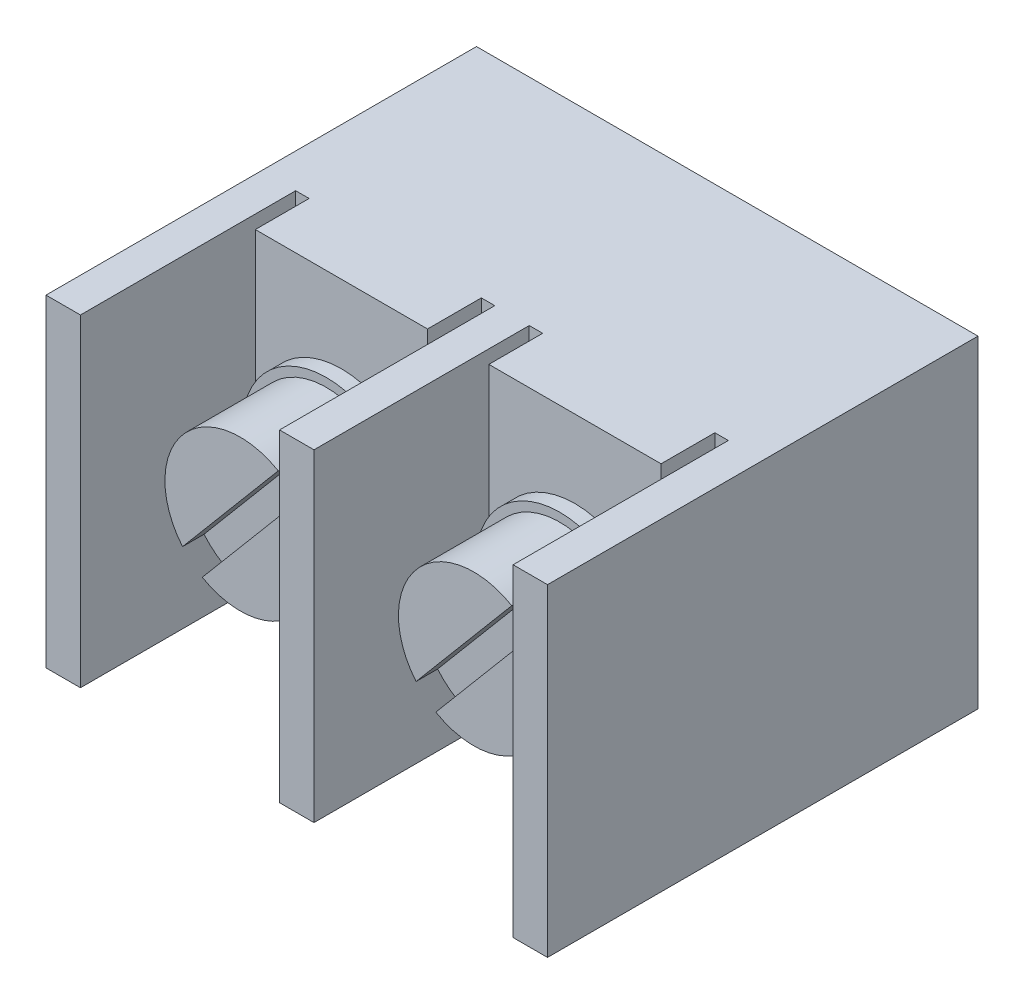
ISO-10303-21;
HEADER;
FILE_DESCRIPTION(('STEP AP214'),'2;1');
FILE_NAME('part.step','',(''),(''),'','','');
FILE_SCHEMA(('AUTOMOTIVE_DESIGN { 1 0 10303 214 1 1 1 1 }'));
ENDSEC;
DATA;
#1=APPLICATION_CONTEXT('core data for automotive mechanical design processes');
#2=APPLICATION_PROTOCOL_DEFINITION('international standard','automotive_design',2000,#1);
#3=PRODUCT_CONTEXT('',#1,'mechanical');
#4=PRODUCT('Part','Part','',(#3));
#5=PRODUCT_RELATED_PRODUCT_CATEGORY('part','',(#4));
#6=PRODUCT_DEFINITION_FORMATION('','',#4);
#7=PRODUCT_DEFINITION_CONTEXT('part definition',#1,'design');
#8=PRODUCT_DEFINITION('design','',#6,#7);
#9=PRODUCT_DEFINITION_SHAPE('','',#8);
#10=(LENGTH_UNIT() NAMED_UNIT(*) SI_UNIT(.MILLI.,.METRE.));
#11=(NAMED_UNIT(*) PLANE_ANGLE_UNIT() SI_UNIT($,.RADIAN.));
#12=(NAMED_UNIT(*) SI_UNIT($,.STERADIAN.) SOLID_ANGLE_UNIT());
#13=UNCERTAINTY_MEASURE_WITH_UNIT(LENGTH_MEASURE(1.E-05),#10,'distance_accuracy_value','');
#14=(GEOMETRIC_REPRESENTATION_CONTEXT(3) GLOBAL_UNCERTAINTY_ASSIGNED_CONTEXT((#13)) GLOBAL_UNIT_ASSIGNED_CONTEXT((#10,
#11,#12)) REPRESENTATION_CONTEXT('',''));
#15=CARTESIAN_POINT('',(0.,0.,0.));
#16=DIRECTION('',(0.,0.,1.));
#17=DIRECTION('',(1.,0.,0.));
#18=AXIS2_PLACEMENT_3D('',#15,#16,#17);
#19=CARTESIAN_POINT('',(-22.5,7.5,0.));
#20=DIRECTION('',(0.,0.,-1.));
#21=DIRECTION('',(-1.,0.,0.));
#22=AXIS2_PLACEMENT_3D('',#19,#20,#21);
#23=PLANE('',#22);
#24=DIRECTION('',(0.,1.,0.));
#25=VECTOR('',#24,1.);
#26=CARTESIAN_POINT('',(0.799999999999999,7.50000000000001,0.));
#27=LINE('',#26,#25);
#28=CARTESIAN_POINT('',(0.800000000000002,-7.5,0.));
#29=VERTEX_POINT('',#28);
#30=CARTESIAN_POINT('',(0.799999999999992,7.5,0.));
#31=VERTEX_POINT('',#30);
#32=EDGE_CURVE('E236',#29,#31,#27,.T.);
#33=ORIENTED_EDGE('',*,*,#32,.F.);
#34=DIRECTION('',(1.,0.,0.));
#35=VECTOR('',#34,1.);
#36=CARTESIAN_POINT('',(-22.5,-7.5,0.));
#37=LINE('',#36,#35);
#38=CARTESIAN_POINT('',(-22.5,-7.5,0.));
#39=VERTEX_POINT('',#38);
#40=EDGE_CURVE('E246',#39,#29,#37,.T.);
#41=ORIENTED_EDGE('',*,*,#40,.F.);
#42=DIRECTION('',(0.,-1.,0.));
#43=VECTOR('',#42,1.);
#44=CARTESIAN_POINT('',(-22.5,-7.5,0.));
#45=LINE('',#44,#43);
#46=CARTESIAN_POINT('',(-22.5,7.5,0.));
#47=VERTEX_POINT('',#46);
#48=EDGE_CURVE('E255',#47,#39,#45,.T.);
#49=ORIENTED_EDGE('',*,*,#48,.F.);
#50=DIRECTION('',(-1.,0.,0.));
#51=VECTOR('',#50,1.);
#52=CARTESIAN_POINT('',(-22.5,7.5,0.));
#53=LINE('',#52,#51);
#54=EDGE_CURVE('E248',#31,#47,#53,.T.);
#55=ORIENTED_EDGE('',*,*,#54,.F.);
#56=EDGE_LOOP('',(#33,#41,#49,#55));
#57=FACE_BOUND('',#56,.T.);
#58=CARTESIAN_POINT('',(-15.,0.,0.));
#59=DIRECTION('',(0.,0.,-1.));
#60=DIRECTION('',(-1.,0.,0.));
#61=AXIS2_PLACEMENT_3D('',#58,#59,#60);
#62=CIRCLE('',#61,0.849999999999998);
#63=CARTESIAN_POINT('',(-15.85,0.,0.));
#64=VERTEX_POINT('',#63);
#65=EDGE_CURVE('E249',#64,#64,#62,.T.);
#66=ORIENTED_EDGE('',*,*,#65,.F.);
#67=EDGE_LOOP('',(#66));
#68=FACE_BOUND('',#67,.T.);
#69=CARTESIAN_POINT('',(-5.,0.,0.));
#70=DIRECTION('',(0.,0.,-1.));
#71=DIRECTION('',(-1.,0.,0.));
#72=AXIS2_PLACEMENT_3D('',#69,#70,#71);
#73=CIRCLE('',#72,0.85);
#74=CARTESIAN_POINT('',(-5.85,0.,0.));
#75=VERTEX_POINT('',#74);
#76=EDGE_CURVE('E528',#75,#75,#73,.T.);
#77=ORIENTED_EDGE('',*,*,#76,.F.);
#78=EDGE_LOOP('',(#77));
#79=FACE_BOUND('',#78,.T.);
#80=ADVANCED_FACE('F47',(#57,#68,#79),#23,.T.);
#81=CARTESIAN_POINT('',(-5.425,0.,17.2));
#82=DIRECTION('',(0.,0.,1.));
#83=DIRECTION('',(1.,0.,0.));
#84=AXIS2_PLACEMENT_3D('',#81,#82,#83);
#85=PLANE('',#84);
#86=DIRECTION('',(-0.644608233576688,-0.764513064116724,0.));
#87=VECTOR('',#86,1.);
#88=CARTESIAN_POINT('',(-3.66097750792814,3.02294966009436,17.2));
#89=LINE('',#88,#87);
#90=CARTESIAN_POINT('',(-3.66097750792814,3.02294966009436,17.2));
#91=VERTEX_POINT('',#90);
#92=CARTESIAN_POINT('',(-8.10643816901193,-2.24941977980233,17.2));
#93=VERTEX_POINT('',#92);
#94=EDGE_CURVE('E513',#91,#93,#89,.T.);
#95=ORIENTED_EDGE('',*,*,#94,.F.);
#96=CARTESIAN_POINT('',(-5.425,0.,17.2));
#97=DIRECTION('',(0.,0.,1.));
#98=DIRECTION('',(1.,0.,0.));
#99=AXIS2_PLACEMENT_3D('',#96,#97,#98);
#100=CIRCLE('',#99,3.5);
#101=EDGE_CURVE('E469',#91,#93,#100,.T.);
#102=ORIENTED_EDGE('',*,*,#101,.T.);
#103=EDGE_LOOP('',(#95,#102));
#104=FACE_BOUND('',#103,.T.);
#105=ADVANCED_FACE('F319',(#104),#85,.T.);
#106=CARTESIAN_POINT('',(-16.275,0.,17.2));
#107=DIRECTION('',(0.,0.,1.));
#108=DIRECTION('',(1.,0.,0.));
#109=AXIS2_PLACEMENT_3D('',#106,#107,#108);
#110=PLANE('',#109);
#111=DIRECTION('',(-0.644608233576688,-0.764513064116724,0.));
#112=VECTOR('',#111,1.);
#113=CARTESIAN_POINT('',(-14.5109775079281,3.02294966009436,17.2));
#114=LINE('',#113,#112);
#115=CARTESIAN_POINT('',(-14.5109775079281,3.02294966009436,17.2));
#116=VERTEX_POINT('',#115);
#117=CARTESIAN_POINT('',(-18.9564381690119,-2.24941977980233,17.2));
#118=VERTEX_POINT('',#117);
#119=EDGE_CURVE('E489',#116,#118,#114,.T.);
#120=ORIENTED_EDGE('',*,*,#119,.F.);
#121=CARTESIAN_POINT('',(-16.275,0.,17.2));
#122=DIRECTION('',(0.,0.,1.));
#123=DIRECTION('',(1.,0.,0.));
#124=AXIS2_PLACEMENT_3D('',#121,#122,#123);
#125=CIRCLE('',#124,3.5);
#126=EDGE_CURVE('E464',#116,#118,#125,.T.);
#127=ORIENTED_EDGE('',*,*,#126,.T.);
#128=EDGE_LOOP('',(#120,#127));
#129=FACE_BOUND('',#128,.T.);
#130=ADVANCED_FACE('F324',(#129),#110,.T.);
#131=CARTESIAN_POINT('',(-5.425,0.,13.2));
#132=DIRECTION('',(0.,0.,1.));
#133=DIRECTION('',(1.,0.,0.));
#134=AXIS2_PLACEMENT_3D('',#131,#132,#133);
#135=PLANE('',#134);
#136=CARTESIAN_POINT('',(-5.425,0.,13.2));
#137=DIRECTION('',(0.,0.,1.));
#138=DIRECTION('',(1.,0.,0.));
#139=AXIS2_PLACEMENT_3D('',#136,#137,#138);
#140=CIRCLE('',#139,3.9);
#141=CARTESIAN_POINT('',(-1.525,0.,13.2));
#142=VERTEX_POINT('',#141);
#143=EDGE_CURVE('E461',#142,#142,#140,.T.);
#144=ORIENTED_EDGE('',*,*,#143,.T.);
#145=EDGE_LOOP('',(#144));
#146=FACE_BOUND('',#145,.T.);
#147=CARTESIAN_POINT('',(-5.425,0.,13.2));
#148=DIRECTION('',(0.,0.,1.));
#149=DIRECTION('',(1.,0.,0.));
#150=AXIS2_PLACEMENT_3D('',#147,#148,#149);
#151=CIRCLE('',#150,3.5);
#152=CARTESIAN_POINT('',(-1.925,0.,13.2));
#153=VERTEX_POINT('',#152);
#154=EDGE_CURVE('E472',#153,#153,#151,.T.);
#155=ORIENTED_EDGE('',*,*,#154,.F.);
#156=EDGE_LOOP('',(#155));
#157=FACE_BOUND('',#156,.T.);
#158=ADVANCED_FACE('F599',(#146,#157),#135,.T.);
#159=CARTESIAN_POINT('',(-16.275,0.,13.2));
#160=DIRECTION('',(0.,0.,1.));
#161=DIRECTION('',(1.,0.,0.));
#162=AXIS2_PLACEMENT_3D('',#159,#160,#161);
#163=PLANE('',#162);
#164=CARTESIAN_POINT('',(-16.275,0.,13.2));
#165=DIRECTION('',(0.,0.,1.));
#166=DIRECTION('',(1.,0.,0.));
#167=AXIS2_PLACEMENT_3D('',#164,#165,#166);
#168=CIRCLE('',#167,3.9);
#169=CARTESIAN_POINT('',(-12.375,0.,13.2));
#170=VERTEX_POINT('',#169);
#171=EDGE_CURVE('E451',#170,#170,#168,.T.);
#172=ORIENTED_EDGE('',*,*,#171,.T.);
#173=EDGE_LOOP('',(#172));
#174=FACE_BOUND('',#173,.T.);
#175=CARTESIAN_POINT('',(-16.275,0.,13.2));
#176=DIRECTION('',(0.,0.,1.));
#177=DIRECTION('',(1.,0.,0.));
#178=AXIS2_PLACEMENT_3D('',#175,#176,#177);
#179=CIRCLE('',#178,3.5);
#180=CARTESIAN_POINT('',(-12.775,0.,13.2));
#181=VERTEX_POINT('',#180);
#182=EDGE_CURVE('E465',#181,#181,#179,.T.);
#183=ORIENTED_EDGE('',*,*,#182,.F.);
#184=EDGE_LOOP('',(#183));
#185=FACE_BOUND('',#184,.T.);
#186=ADVANCED_FACE('F312',(#174,#185),#163,.T.);
#187=CARTESIAN_POINT('',(-9.425,-7.5,12.5));
#188=DIRECTION('',(0.,0.,-1.));
#189=DIRECTION('',(-1.,0.,0.));
#190=AXIS2_PLACEMENT_3D('',#187,#188,#189);
#191=PLANE('',#190);
#192=DIRECTION('',(0.,-1.,0.));
#193=VECTOR('',#192,1.);
#194=CARTESIAN_POINT('',(-9.425,-7.5,12.5));
#195=LINE('',#194,#193);
#196=CARTESIAN_POINT('',(-9.425,7.5,12.5));
#197=VERTEX_POINT('',#196);
#198=CARTESIAN_POINT('',(-9.425,-7.5,12.5));
#199=VERTEX_POINT('',#198);
#200=EDGE_CURVE('E447',#197,#199,#195,.T.);
#201=ORIENTED_EDGE('',*,*,#200,.T.);
#202=DIRECTION('',(1.,0.,0.));
#203=VECTOR('',#202,1.);
#204=CARTESIAN_POINT('',(-9.425,-7.5,12.5));
#205=LINE('',#204,#203);
#206=CARTESIAN_POINT('',(-1.425,-7.49999999999999,12.5));
#207=VERTEX_POINT('',#206);
#208=EDGE_CURVE('E455',#199,#207,#205,.T.);
#209=ORIENTED_EDGE('',*,*,#208,.T.);
#210=DIRECTION('',(0.,1.,0.));
#211=VECTOR('',#210,1.);
#212=CARTESIAN_POINT('',(-1.425,-7.49999999999999,12.5));
#213=LINE('',#212,#211);
#214=CARTESIAN_POINT('',(-1.425,7.50000000000001,12.5));
#215=VERTEX_POINT('',#214);
#216=EDGE_CURVE('E453',#207,#215,#213,.T.);
#217=ORIENTED_EDGE('',*,*,#216,.T.);
#218=DIRECTION('',(-1.,0.,0.));
#219=VECTOR('',#218,1.);
#220=CARTESIAN_POINT('',(-9.425,7.5,12.5));
#221=LINE('',#220,#219);
#222=EDGE_CURVE('E443',#215,#197,#221,.T.);
#223=ORIENTED_EDGE('',*,*,#222,.T.);
#224=EDGE_LOOP('',(#201,#209,#217,#223));
#225=FACE_BOUND('',#224,.T.);
#226=CARTESIAN_POINT('',(-5.425,0.,12.5));
#227=DIRECTION('',(0.,0.,-1.));
#228=DIRECTION('',(-1.,0.,0.));
#229=AXIS2_PLACEMENT_3D('',#226,#227,#228);
#230=CIRCLE('',#229,3.9);
#231=CARTESIAN_POINT('',(-9.325,0.,12.5));
#232=VERTEX_POINT('',#231);
#233=EDGE_CURVE('E13',#232,#232,#230,.F.);
#234=ORIENTED_EDGE('',*,*,#233,.F.);
#235=EDGE_LOOP('',(#234));
#236=FACE_BOUND('',#235,.T.);
#237=ADVANCED_FACE('F301',(#225,#236),#191,.F.);
#238=CARTESIAN_POINT('',(-20.275,-7.5,12.5));
#239=DIRECTION('',(0.,0.,-1.));
#240=DIRECTION('',(-1.,0.,0.));
#241=AXIS2_PLACEMENT_3D('',#238,#239,#240);
#242=PLANE('',#241);
#243=DIRECTION('',(0.,-1.,0.));
#244=VECTOR('',#243,1.);
#245=CARTESIAN_POINT('',(-20.275,-7.5,12.5));
#246=LINE('',#245,#244);
#247=CARTESIAN_POINT('',(-20.275,7.5,12.5));
#248=VERTEX_POINT('',#247);
#249=CARTESIAN_POINT('',(-20.275,-7.5,12.5));
#250=VERTEX_POINT('',#249);
#251=EDGE_CURVE('E421',#248,#250,#246,.T.);
#252=ORIENTED_EDGE('',*,*,#251,.T.);
#253=DIRECTION('',(1.,0.,0.));
#254=VECTOR('',#253,1.);
#255=CARTESIAN_POINT('',(-20.275,-7.5,12.5));
#256=LINE('',#255,#254);
#257=CARTESIAN_POINT('',(-12.275,-7.49999999999999,12.5));
#258=VERTEX_POINT('',#257);
#259=EDGE_CURVE('E429',#250,#258,#256,.T.);
#260=ORIENTED_EDGE('',*,*,#259,.T.);
#261=DIRECTION('',(0.,1.,0.));
#262=VECTOR('',#261,1.);
#263=CARTESIAN_POINT('',(-12.275,-7.49999999999999,12.5));
#264=LINE('',#263,#262);
#265=CARTESIAN_POINT('',(-12.275,7.50000000000001,12.5));
#266=VERTEX_POINT('',#265);
#267=EDGE_CURVE('E427',#258,#266,#264,.T.);
#268=ORIENTED_EDGE('',*,*,#267,.T.);
#269=DIRECTION('',(-1.,0.,0.));
#270=VECTOR('',#269,1.);
#271=CARTESIAN_POINT('',(-20.275,7.5,12.5));
#272=LINE('',#271,#270);
#273=EDGE_CURVE('E417',#266,#248,#272,.T.);
#274=ORIENTED_EDGE('',*,*,#273,.T.);
#275=EDGE_LOOP('',(#252,#260,#268,#274));
#276=FACE_BOUND('',#275,.T.);
#277=CARTESIAN_POINT('',(-16.275,0.,12.5));
#278=DIRECTION('',(0.,0.,-1.));
#279=DIRECTION('',(-1.,0.,0.));
#280=AXIS2_PLACEMENT_3D('',#277,#278,#279);
#281=CIRCLE('',#280,3.9);
#282=CARTESIAN_POINT('',(-20.175,0.,12.5));
#283=VERTEX_POINT('',#282);
#284=EDGE_CURVE('E55',#283,#283,#281,.F.);
#285=ORIENTED_EDGE('',*,*,#284,.F.);
#286=EDGE_LOOP('',(#285));
#287=FACE_BOUND('',#286,.T.);
#288=ADVANCED_FACE('F298',(#276,#287),#242,.F.);
#289=CARTESIAN_POINT('',(-22.5,7.5,10.));
#290=DIRECTION('',(0.,0.,-1.));
#291=DIRECTION('',(-1.,0.,0.));
#292=AXIS2_PLACEMENT_3D('',#289,#290,#291);
#293=PLANE('',#292);
#294=DIRECTION('',(0.,-1.,0.));
#295=VECTOR('',#294,1.);
#296=CARTESIAN_POINT('',(-9.425,-7.5,10.));
#297=LINE('',#296,#295);
#298=CARTESIAN_POINT('',(-9.425,7.5,10.));
#299=VERTEX_POINT('',#298);
#300=CARTESIAN_POINT('',(-9.42500000000001,-7.5,10.));
#301=VERTEX_POINT('',#300);
#302=EDGE_CURVE('E448',#299,#301,#297,.T.);
#303=ORIENTED_EDGE('',*,*,#302,.F.);
#304=DIRECTION('',(-1.,0.,0.));
#305=VECTOR('',#304,1.);
#306=CARTESIAN_POINT('',(-22.5,7.5,10.));
#307=LINE('',#306,#305);
#308=CARTESIAN_POINT('',(-10.05,7.5,10.));
#309=VERTEX_POINT('',#308);
#310=EDGE_CURVE('E291',#299,#309,#307,.T.);
#311=ORIENTED_EDGE('',*,*,#310,.T.);
#312=DIRECTION('',(0.,1.,0.));
#313=VECTOR('',#312,1.);
#314=CARTESIAN_POINT('',(-10.05,-7.5,10.));
#315=LINE('',#314,#313);
#316=CARTESIAN_POINT('',(-10.05,-7.5,10.));
#317=VERTEX_POINT('',#316);
#318=EDGE_CURVE('E374',#317,#309,#315,.T.);
#319=ORIENTED_EDGE('',*,*,#318,.F.);
#320=DIRECTION('',(1.,0.,0.));
#321=VECTOR('',#320,1.);
#322=CARTESIAN_POINT('',(-22.5,-7.5,10.));
#323=LINE('',#322,#321);
#324=EDGE_CURVE('E285',#317,#301,#323,.T.);
#325=ORIENTED_EDGE('',*,*,#324,.T.);
#326=EDGE_LOOP('',(#303,#311,#319,#325));
#327=FACE_BOUND('',#326,.T.);
#328=ADVANCED_FACE('F300',(#327),#293,.F.);
#329=DIRECTION('',(0.,1.,0.));
#330=VECTOR('',#329,1.);
#331=CARTESIAN_POINT('',(-1.425,-7.49999999999999,10.));
#332=LINE('',#331,#330);
#333=CARTESIAN_POINT('',(-1.425,-7.5,10.));
#334=VERTEX_POINT('',#333);
#335=CARTESIAN_POINT('',(-1.425,7.5,10.));
#336=VERTEX_POINT('',#335);
#337=EDGE_CURVE('E444',#334,#336,#332,.T.);
#338=ORIENTED_EDGE('',*,*,#337,.F.);
#339=CARTESIAN_POINT('',(-0.800000000000006,-7.5,10.));
#340=VERTEX_POINT('',#339);
#341=EDGE_CURVE('E257',#334,#340,#323,.T.);
#342=ORIENTED_EDGE('',*,*,#341,.T.);
#343=DIRECTION('',(0.,-1.,0.));
#344=VECTOR('',#343,1.);
#345=CARTESIAN_POINT('',(-0.799999999999999,-7.5,10.));
#346=LINE('',#345,#344);
#347=CARTESIAN_POINT('',(-0.8,7.5,10.));
#348=VERTEX_POINT('',#347);
#349=EDGE_CURVE('E395',#348,#340,#346,.T.);
#350=ORIENTED_EDGE('',*,*,#349,.F.);
#351=EDGE_CURVE('E266',#348,#336,#307,.T.);
#352=ORIENTED_EDGE('',*,*,#351,.T.);
#353=EDGE_LOOP('',(#338,#342,#350,#352));
#354=FACE_BOUND('',#353,.T.);
#355=ADVANCED_FACE('F308',(#354),#293,.F.);
#356=DIRECTION('',(0.,-1.,0.));
#357=VECTOR('',#356,1.);
#358=CARTESIAN_POINT('',(-20.275,-7.5,10.));
#359=LINE('',#358,#357);
#360=CARTESIAN_POINT('',(-20.275,7.5,10.));
#361=VERTEX_POINT('',#360);
#362=CARTESIAN_POINT('',(-20.275,-7.5,10.));
#363=VERTEX_POINT('',#362);
#364=EDGE_CURVE('E422',#361,#363,#359,.T.);
#365=ORIENTED_EDGE('',*,*,#364,.F.);
#366=CARTESIAN_POINT('',(-20.9,7.5,10.));
#367=VERTEX_POINT('',#366);
#368=EDGE_CURVE('E271',#361,#367,#307,.T.);
#369=ORIENTED_EDGE('',*,*,#368,.T.);
#370=DIRECTION('',(0.,1.,0.));
#371=VECTOR('',#370,1.);
#372=CARTESIAN_POINT('',(-20.9,-7.5,10.));
#373=LINE('',#372,#371);
#374=CARTESIAN_POINT('',(-20.9,-7.5,10.));
#375=VERTEX_POINT('',#374);
#376=EDGE_CURVE('E273',#375,#367,#373,.T.);
#377=ORIENTED_EDGE('',*,*,#376,.F.);
#378=EDGE_CURVE('E268',#375,#363,#323,.T.);
#379=ORIENTED_EDGE('',*,*,#378,.T.);
#380=EDGE_LOOP('',(#365,#369,#377,#379));
#381=FACE_BOUND('',#380,.T.);
#382=ADVANCED_FACE('F311',(#381),#293,.F.);
#383=DIRECTION('',(0.,1.,0.));
#384=VECTOR('',#383,1.);
#385=CARTESIAN_POINT('',(-12.275,-7.49999999999999,10.));
#386=LINE('',#385,#384);
#387=CARTESIAN_POINT('',(-12.275,-7.5,10.));
#388=VERTEX_POINT('',#387);
#389=CARTESIAN_POINT('',(-12.275,7.5,10.));
#390=VERTEX_POINT('',#389);
#391=EDGE_CURVE('E418',#388,#390,#386,.T.);
#392=ORIENTED_EDGE('',*,*,#391,.F.);
#393=CARTESIAN_POINT('',(-11.65,-7.5,10.));
#394=VERTEX_POINT('',#393);
#395=EDGE_CURVE('E272',#388,#394,#323,.T.);
#396=ORIENTED_EDGE('',*,*,#395,.T.);
#397=DIRECTION('',(0.,-1.,0.));
#398=VECTOR('',#397,1.);
#399=CARTESIAN_POINT('',(-11.65,-7.5,10.));
#400=LINE('',#399,#398);
#401=CARTESIAN_POINT('',(-11.65,7.5,10.));
#402=VERTEX_POINT('',#401);
#403=EDGE_CURVE('E378',#402,#394,#400,.T.);
#404=ORIENTED_EDGE('',*,*,#403,.F.);
#405=EDGE_CURVE('E292',#402,#390,#307,.T.);
#406=ORIENTED_EDGE('',*,*,#405,.T.);
#407=EDGE_LOOP('',(#392,#396,#404,#406));
#408=FACE_BOUND('',#407,.T.);
#409=ADVANCED_FACE('F337',(#408),#293,.F.);
#410=CARTESIAN_POINT('',(-22.5,-7.5,10.));
#411=DIRECTION('',(1.,0.,0.));
#412=DIRECTION('',(0.,0.,-1.));
#413=AXIS2_PLACEMENT_3D('',#410,#411,#412);
#414=PLANE('',#413);
#415=ORIENTED_EDGE('',*,*,#48,.T.);
#416=DIRECTION('',(0.,0.,-1.));
#417=VECTOR('',#416,1.);
#418=CARTESIAN_POINT('',(-22.5,-7.5,10.));
#419=LINE('',#418,#417);
#420=CARTESIAN_POINT('',(-22.5,-7.5,20.));
#421=VERTEX_POINT('',#420);
#422=EDGE_CURVE('E253',#421,#39,#419,.T.);
#423=ORIENTED_EDGE('',*,*,#422,.F.);
#424=DIRECTION('',(0.,-1.,0.));
#425=VECTOR('',#424,1.);
#426=CARTESIAN_POINT('',(-22.5,-7.5,20.));
#427=LINE('',#426,#425);
#428=CARTESIAN_POINT('',(-22.5,7.5,20.));
#429=VERTEX_POINT('',#428);
#430=EDGE_CURVE('E345',#429,#421,#427,.T.);
#431=ORIENTED_EDGE('',*,*,#430,.F.);
#432=DIRECTION('',(0.,0.,-1.));
#433=VECTOR('',#432,1.);
#434=CARTESIAN_POINT('',(-22.5,7.5,10.));
#435=LINE('',#434,#433);
#436=EDGE_CURVE('E263',#429,#47,#435,.T.);
#437=ORIENTED_EDGE('',*,*,#436,.T.);
#438=EDGE_LOOP('',(#415,#423,#431,#437));
#439=FACE_BOUND('',#438,.T.);
#440=ADVANCED_FACE('F49',(#439),#414,.F.);
#441=CARTESIAN_POINT('',(-22.5,-7.5,10.));
#442=DIRECTION('',(0.,1.,0.));
#443=DIRECTION('',(0.,0.,1.));
#444=AXIS2_PLACEMENT_3D('',#441,#442,#443);
#445=PLANE('',#444);
#446=ORIENTED_EDGE('',*,*,#40,.T.);
#447=DIRECTION('',(0.,0.,-1.));
#448=VECTOR('',#447,1.);
#449=CARTESIAN_POINT('',(0.800000000000004,-7.5,20.));
#450=LINE('',#449,#448);
#451=CARTESIAN_POINT('',(0.800000000000004,-7.5,20.));
#452=VERTEX_POINT('',#451);
#453=EDGE_CURVE('E233',#452,#29,#450,.T.);
#454=ORIENTED_EDGE('',*,*,#453,.F.);
#455=DIRECTION('',(1.,0.,0.));
#456=VECTOR('',#455,1.);
#457=CARTESIAN_POINT('',(-0.799999999999999,-7.5,20.));
#458=LINE('',#457,#456);
#459=CARTESIAN_POINT('',(-0.799999999999999,-7.5,20.));
#460=VERTEX_POINT('',#459);
#461=EDGE_CURVE('E402',#460,#452,#458,.T.);
#462=ORIENTED_EDGE('',*,*,#461,.F.);
#463=DIRECTION('',(0.,0.,-1.));
#464=VECTOR('',#463,1.);
#465=CARTESIAN_POINT('',(-0.799999999999999,-7.5,20.));
#466=LINE('',#465,#464);
#467=EDGE_CURVE('E241',#460,#340,#466,.T.);
#468=ORIENTED_EDGE('',*,*,#467,.T.);
#469=ORIENTED_EDGE('',*,*,#341,.F.);
#470=DIRECTION('',(0.,0.,-1.));
#471=VECTOR('',#470,1.);
#472=CARTESIAN_POINT('',(-1.425,-7.49999999999999,12.5));
#473=LINE('',#472,#471);
#474=EDGE_CURVE('E434',#207,#334,#473,.T.);
#475=ORIENTED_EDGE('',*,*,#474,.F.);
#476=ORIENTED_EDGE('',*,*,#208,.F.);
#477=DIRECTION('',(0.,0.,-1.));
#478=VECTOR('',#477,1.);
#479=CARTESIAN_POINT('',(-9.425,-7.5,12.5));
#480=LINE('',#479,#478);
#481=EDGE_CURVE('E425',#199,#301,#480,.T.);
#482=ORIENTED_EDGE('',*,*,#481,.T.);
#483=ORIENTED_EDGE('',*,*,#324,.F.);
#484=DIRECTION('',(0.,0.,-1.));
#485=VECTOR('',#484,1.);
#486=CARTESIAN_POINT('',(-10.05,-7.5,20.));
#487=LINE('',#486,#485);
#488=CARTESIAN_POINT('',(-10.05,-7.5,20.));
#489=VERTEX_POINT('',#488);
#490=EDGE_CURVE('E364',#489,#317,#487,.T.);
#491=ORIENTED_EDGE('',*,*,#490,.F.);
#492=DIRECTION('',(1.,0.,0.));
#493=VECTOR('',#492,1.);
#494=CARTESIAN_POINT('',(-11.65,-7.5,20.));
#495=LINE('',#494,#493);
#496=CARTESIAN_POINT('',(-11.65,-7.5,20.));
#497=VERTEX_POINT('',#496);
#498=EDGE_CURVE('E384',#497,#489,#495,.T.);
#499=ORIENTED_EDGE('',*,*,#498,.F.);
#500=DIRECTION('',(0.,0.,-1.));
#501=VECTOR('',#500,1.);
#502=CARTESIAN_POINT('',(-11.65,-7.5,20.));
#503=LINE('',#502,#501);
#504=EDGE_CURVE('E361',#497,#394,#503,.T.);
#505=ORIENTED_EDGE('',*,*,#504,.T.);
#506=ORIENTED_EDGE('',*,*,#395,.F.);
#507=DIRECTION('',(0.,0.,-1.));
#508=VECTOR('',#507,1.);
#509=CARTESIAN_POINT('',(-12.275,-7.49999999999999,12.5));
#510=LINE('',#509,#508);
#511=EDGE_CURVE('E408',#258,#388,#510,.T.);
#512=ORIENTED_EDGE('',*,*,#511,.F.);
#513=ORIENTED_EDGE('',*,*,#259,.F.);
#514=DIRECTION('',(0.,0.,-1.));
#515=VECTOR('',#514,1.);
#516=CARTESIAN_POINT('',(-20.275,-7.5,12.5));
#517=LINE('',#516,#515);
#518=EDGE_CURVE('E399',#250,#363,#517,.T.);
#519=ORIENTED_EDGE('',*,*,#518,.T.);
#520=ORIENTED_EDGE('',*,*,#378,.F.);
#521=DIRECTION('',(0.,0.,-1.));
#522=VECTOR('',#521,1.);
#523=CARTESIAN_POINT('',(-20.9,-7.5,20.));
#524=LINE('',#523,#522);
#525=CARTESIAN_POINT('',(-20.9,-7.5,20.));
#526=VERTEX_POINT('',#525);
#527=EDGE_CURVE('E259',#526,#375,#524,.T.);
#528=ORIENTED_EDGE('',*,*,#527,.F.);
#529=DIRECTION('',(1.,0.,0.));
#530=VECTOR('',#529,1.);
#531=CARTESIAN_POINT('',(-22.5,-7.5,20.));
#532=LINE('',#531,#530);
#533=EDGE_CURVE('E356',#421,#526,#532,.T.);
#534=ORIENTED_EDGE('',*,*,#533,.F.);
#535=ORIENTED_EDGE('',*,*,#422,.T.);
#536=EDGE_LOOP('',(#446,#454,#462,#468,#469,#475,#476,#482,#483,#491,#499,#505,#506,#512,#513,
#519,#520,#528,#534,#535));
#537=FACE_BOUND('',#536,.T.);
#538=ADVANCED_FACE('F251',(#537),#445,.F.);
#539=CARTESIAN_POINT('',(-22.5,7.5,10.));
#540=DIRECTION('',(0.,-1.,0.));
#541=DIRECTION('',(0.,0.,-1.));
#542=AXIS2_PLACEMENT_3D('',#539,#540,#541);
#543=PLANE('',#542);
#544=DIRECTION('',(0.,0.,-1.));
#545=VECTOR('',#544,1.);
#546=CARTESIAN_POINT('',(0.800000000000001,7.5,20.));
#547=LINE('',#546,#545);
#548=CARTESIAN_POINT('',(0.800000000000001,7.5,20.));
#549=VERTEX_POINT('',#548);
#550=EDGE_CURVE('E62',#549,#31,#547,.T.);
#551=ORIENTED_EDGE('',*,*,#550,.T.);
#552=ORIENTED_EDGE('',*,*,#54,.T.);
#553=ORIENTED_EDGE('',*,*,#436,.F.);
#554=DIRECTION('',(-1.,0.,0.));
#555=VECTOR('',#554,1.);
#556=CARTESIAN_POINT('',(-22.5,7.5,20.));
#557=LINE('',#556,#555);
#558=CARTESIAN_POINT('',(-20.9,7.5,20.));
#559=VERTEX_POINT('',#558);
#560=EDGE_CURVE('E349',#559,#429,#557,.T.);
#561=ORIENTED_EDGE('',*,*,#560,.F.);
#562=DIRECTION('',(0.,0.,-1.));
#563=VECTOR('',#562,1.);
#564=CARTESIAN_POINT('',(-20.9,7.5,20.));
#565=LINE('',#564,#563);
#566=EDGE_CURVE('E355',#559,#367,#565,.T.);
#567=ORIENTED_EDGE('',*,*,#566,.T.);
#568=ORIENTED_EDGE('',*,*,#368,.F.);
#569=DIRECTION('',(0.,0.,-1.));
#570=VECTOR('',#569,1.);
#571=CARTESIAN_POINT('',(-20.275,7.5,12.5));
#572=LINE('',#571,#570);
#573=EDGE_CURVE('E414',#248,#361,#572,.T.);
#574=ORIENTED_EDGE('',*,*,#573,.F.);
#575=ORIENTED_EDGE('',*,*,#273,.F.);
#576=DIRECTION('',(0.,0.,-1.));
#577=VECTOR('',#576,1.);
#578=CARTESIAN_POINT('',(-12.275,7.50000000000001,12.5));
#579=LINE('',#578,#577);
#580=EDGE_CURVE('E411',#266,#390,#579,.T.);
#581=ORIENTED_EDGE('',*,*,#580,.T.);
#582=ORIENTED_EDGE('',*,*,#405,.F.);
#583=DIRECTION('',(0.,0.,-1.));
#584=VECTOR('',#583,1.);
#585=CARTESIAN_POINT('',(-11.65,7.5,20.));
#586=LINE('',#585,#584);
#587=CARTESIAN_POINT('',(-11.65,7.5,20.));
#588=VERTEX_POINT('',#587);
#589=EDGE_CURVE('E370',#588,#402,#586,.T.);
#590=ORIENTED_EDGE('',*,*,#589,.F.);
#591=DIRECTION('',(-1.,0.,0.));
#592=VECTOR('',#591,1.);
#593=CARTESIAN_POINT('',(-11.65,7.5,20.));
#594=LINE('',#593,#592);
#595=CARTESIAN_POINT('',(-10.05,7.5,20.));
#596=VERTEX_POINT('',#595);
#597=EDGE_CURVE('E373',#596,#588,#594,.T.);
#598=ORIENTED_EDGE('',*,*,#597,.F.);
#599=DIRECTION('',(0.,0.,-1.));
#600=VECTOR('',#599,1.);
#601=CARTESIAN_POINT('',(-10.05,7.5,20.));
#602=LINE('',#601,#600);
#603=EDGE_CURVE('E367',#596,#309,#602,.T.);
#604=ORIENTED_EDGE('',*,*,#603,.T.);
#605=ORIENTED_EDGE('',*,*,#310,.F.);
#606=DIRECTION('',(0.,0.,-1.));
#607=VECTOR('',#606,1.);
#608=CARTESIAN_POINT('',(-9.425,7.5,12.5));
#609=LINE('',#608,#607);
#610=EDGE_CURVE('E440',#197,#299,#609,.T.);
#611=ORIENTED_EDGE('',*,*,#610,.F.);
#612=ORIENTED_EDGE('',*,*,#222,.F.);
#613=DIRECTION('',(0.,0.,-1.));
#614=VECTOR('',#613,1.);
#615=CARTESIAN_POINT('',(-1.425,7.50000000000001,12.5));
#616=LINE('',#615,#614);
#617=EDGE_CURVE('E437',#215,#336,#616,.T.);
#618=ORIENTED_EDGE('',*,*,#617,.T.);
#619=ORIENTED_EDGE('',*,*,#351,.F.);
#620=DIRECTION('',(0.,0.,-1.));
#621=VECTOR('',#620,1.);
#622=CARTESIAN_POINT('',(-0.8,7.5,20.));
#623=LINE('',#622,#621);
#624=CARTESIAN_POINT('',(-0.8,7.5,20.));
#625=VERTEX_POINT('',#624);
#626=EDGE_CURVE('E391',#625,#348,#623,.T.);
#627=ORIENTED_EDGE('',*,*,#626,.F.);
#628=DIRECTION('',(-1.,0.,0.));
#629=VECTOR('',#628,1.);
#630=CARTESIAN_POINT('',(-0.8,7.5,20.));
#631=LINE('',#630,#629);
#632=EDGE_CURVE('E394',#549,#625,#631,.T.);
#633=ORIENTED_EDGE('',*,*,#632,.F.);
#634=EDGE_LOOP('',(#551,#552,#553,#561,#567,#568,#574,#575,#581,#582,#590,#598,#604,#605,#611,
#612,#618,#619,#627,#633));
#635=FACE_BOUND('',#634,.T.);
#636=ADVANCED_FACE('F330',(#635),#543,.F.);
#637=CARTESIAN_POINT('',(-20.9,-7.5,20.));
#638=DIRECTION('',(-1.,0.,0.));
#639=DIRECTION('',(0.,0.,1.));
#640=AXIS2_PLACEMENT_3D('',#637,#638,#639);
#641=PLANE('',#640);
#642=ORIENTED_EDGE('',*,*,#376,.T.);
#643=ORIENTED_EDGE('',*,*,#566,.F.);
#644=DIRECTION('',(0.,1.,0.));
#645=VECTOR('',#644,1.);
#646=CARTESIAN_POINT('',(-20.9,-7.5,20.));
#647=LINE('',#646,#645);
#648=EDGE_CURVE('E353',#526,#559,#647,.T.);
#649=ORIENTED_EDGE('',*,*,#648,.F.);
#650=ORIENTED_EDGE('',*,*,#527,.T.);
#651=EDGE_LOOP('',(#642,#643,#649,#650));
#652=FACE_BOUND('',#651,.T.);
#653=ADVANCED_FACE('F332',(#652),#641,.F.);
#654=CARTESIAN_POINT('',(-22.5,7.5,20.));
#655=DIRECTION('',(0.,0.,-1.));
#656=DIRECTION('',(-1.,0.,0.));
#657=AXIS2_PLACEMENT_3D('',#654,#655,#656);
#658=PLANE('',#657);
#659=ORIENTED_EDGE('',*,*,#430,.T.);
#660=ORIENTED_EDGE('',*,*,#533,.T.);
#661=ORIENTED_EDGE('',*,*,#648,.T.);
#662=ORIENTED_EDGE('',*,*,#560,.T.);
#663=EDGE_LOOP('',(#659,#660,#661,#662));
#664=FACE_BOUND('',#663,.T.);
#665=ADVANCED_FACE('F351',(#664),#658,.F.);
#666=CARTESIAN_POINT('',(-11.65,-7.5,20.));
#667=DIRECTION('',(1.,0.,0.));
#668=DIRECTION('',(0.,0.,-1.));
#669=AXIS2_PLACEMENT_3D('',#666,#667,#668);
#670=PLANE('',#669);
#671=ORIENTED_EDGE('',*,*,#403,.T.);
#672=ORIENTED_EDGE('',*,*,#504,.F.);
#673=DIRECTION('',(0.,-1.,0.));
#674=VECTOR('',#673,1.);
#675=CARTESIAN_POINT('',(-11.65,-7.5,20.));
#676=LINE('',#675,#674);
#677=EDGE_CURVE('E377',#588,#497,#676,.T.);
#678=ORIENTED_EDGE('',*,*,#677,.F.);
#679=ORIENTED_EDGE('',*,*,#589,.T.);
#680=EDGE_LOOP('',(#671,#672,#678,#679));
#681=FACE_BOUND('',#680,.T.);
#682=ADVANCED_FACE('F648',(#681),#670,.F.);
#683=CARTESIAN_POINT('',(-10.05,-7.5,20.));
#684=DIRECTION('',(-1.,0.,0.));
#685=DIRECTION('',(0.,-1.,0.));
#686=AXIS2_PLACEMENT_3D('',#683,#684,#685);
#687=PLANE('',#686);
#688=ORIENTED_EDGE('',*,*,#318,.T.);
#689=ORIENTED_EDGE('',*,*,#603,.F.);
#690=DIRECTION('',(0.,1.,0.));
#691=VECTOR('',#690,1.);
#692=CARTESIAN_POINT('',(-10.05,-7.5,20.));
#693=LINE('',#692,#691);
#694=EDGE_CURVE('E382',#489,#596,#693,.T.);
#695=ORIENTED_EDGE('',*,*,#694,.F.);
#696=ORIENTED_EDGE('',*,*,#490,.T.);
#697=EDGE_LOOP('',(#688,#689,#695,#696));
#698=FACE_BOUND('',#697,.T.);
#699=ADVANCED_FACE('F641',(#698),#687,.F.);
#700=CARTESIAN_POINT('',(-11.65,7.5,20.));
#701=DIRECTION('',(0.,0.,-1.));
#702=DIRECTION('',(-1.,0.,0.));
#703=AXIS2_PLACEMENT_3D('',#700,#701,#702);
#704=PLANE('',#703);
#705=ORIENTED_EDGE('',*,*,#677,.T.);
#706=ORIENTED_EDGE('',*,*,#498,.T.);
#707=ORIENTED_EDGE('',*,*,#694,.T.);
#708=ORIENTED_EDGE('',*,*,#597,.T.);
#709=EDGE_LOOP('',(#705,#706,#707,#708));
#710=FACE_BOUND('',#709,.T.);
#711=ADVANCED_FACE('F646',(#710),#704,.F.);
#712=CARTESIAN_POINT('',(-0.799999999999999,-7.5,20.));
#713=DIRECTION('',(1.,0.,0.));
#714=DIRECTION('',(0.,1.,0.));
#715=AXIS2_PLACEMENT_3D('',#712,#713,#714);
#716=PLANE('',#715);
#717=ORIENTED_EDGE('',*,*,#349,.T.);
#718=ORIENTED_EDGE('',*,*,#467,.F.);
#719=DIRECTION('',(0.,-1.,0.));
#720=VECTOR('',#719,1.);
#721=CARTESIAN_POINT('',(-0.799999999999999,-7.5,20.));
#722=LINE('',#721,#720);
#723=EDGE_CURVE('E398',#625,#460,#722,.T.);
#724=ORIENTED_EDGE('',*,*,#723,.F.);
#725=ORIENTED_EDGE('',*,*,#626,.T.);
#726=EDGE_LOOP('',(#717,#718,#724,#725));
#727=FACE_BOUND('',#726,.T.);
#728=ADVANCED_FACE('F682',(#727),#716,.F.);
#729=CARTESIAN_POINT('',(0.800000000000004,-7.5,20.));
#730=DIRECTION('',(-1.,0.,0.));
#731=DIRECTION('',(0.,-1.,0.));
#732=AXIS2_PLACEMENT_3D('',#729,#730,#731);
#733=PLANE('',#732);
#734=ORIENTED_EDGE('',*,*,#453,.T.);
#735=ORIENTED_EDGE('',*,*,#32,.T.);
#736=ORIENTED_EDGE('',*,*,#550,.F.);
#737=DIRECTION('',(0.,1.,0.));
#738=VECTOR('',#737,1.);
#739=CARTESIAN_POINT('',(0.800000000000004,-7.5,20.));
#740=LINE('',#739,#738);
#741=EDGE_CURVE('E238',#452,#549,#740,.T.);
#742=ORIENTED_EDGE('',*,*,#741,.F.);
#743=EDGE_LOOP('',(#734,#735,#736,#742));
#744=FACE_BOUND('',#743,.T.);
#745=ADVANCED_FACE('F235',(#744),#733,.F.);
#746=CARTESIAN_POINT('',(-0.8,7.5,20.));
#747=DIRECTION('',(0.,0.,-1.));
#748=DIRECTION('',(-1.,0.,0.));
#749=AXIS2_PLACEMENT_3D('',#746,#747,#748);
#750=PLANE('',#749);
#751=ORIENTED_EDGE('',*,*,#723,.T.);
#752=ORIENTED_EDGE('',*,*,#461,.T.);
#753=ORIENTED_EDGE('',*,*,#741,.T.);
#754=ORIENTED_EDGE('',*,*,#632,.T.);
#755=EDGE_LOOP('',(#751,#752,#753,#754));
#756=FACE_BOUND('',#755,.T.);
#757=ADVANCED_FACE('F688',(#756),#750,.F.);
#758=CARTESIAN_POINT('',(-20.275,-7.5,12.5));
#759=DIRECTION('',(1.,0.,0.));
#760=DIRECTION('',(0.,0.,-1.));
#761=AXIS2_PLACEMENT_3D('',#758,#759,#760);
#762=PLANE('',#761);
#763=ORIENTED_EDGE('',*,*,#364,.T.);
#764=ORIENTED_EDGE('',*,*,#518,.F.);
#765=ORIENTED_EDGE('',*,*,#251,.F.);
#766=ORIENTED_EDGE('',*,*,#573,.T.);
#767=EDGE_LOOP('',(#763,#764,#765,#766));
#768=FACE_BOUND('',#767,.T.);
#769=ADVANCED_FACE('F622',(#768),#762,.F.);
#770=CARTESIAN_POINT('',(-12.275,-7.49999999999999,12.5));
#771=DIRECTION('',(-1.,0.,0.));
#772=DIRECTION('',(0.,-1.,0.));
#773=AXIS2_PLACEMENT_3D('',#770,#771,#772);
#774=PLANE('',#773);
#775=ORIENTED_EDGE('',*,*,#391,.T.);
#776=ORIENTED_EDGE('',*,*,#580,.F.);
#777=ORIENTED_EDGE('',*,*,#267,.F.);
#778=ORIENTED_EDGE('',*,*,#511,.T.);
#779=EDGE_LOOP('',(#775,#776,#777,#778));
#780=FACE_BOUND('',#779,.T.);
#781=ADVANCED_FACE('F617',(#780),#774,.F.);
#782=CARTESIAN_POINT('',(-9.425,-7.5,12.5));
#783=DIRECTION('',(1.,0.,0.));
#784=DIRECTION('',(0.,0.,-1.));
#785=AXIS2_PLACEMENT_3D('',#782,#783,#784);
#786=PLANE('',#785);
#787=ORIENTED_EDGE('',*,*,#302,.T.);
#788=ORIENTED_EDGE('',*,*,#481,.F.);
#789=ORIENTED_EDGE('',*,*,#200,.F.);
#790=ORIENTED_EDGE('',*,*,#610,.T.);
#791=EDGE_LOOP('',(#787,#788,#789,#790));
#792=FACE_BOUND('',#791,.T.);
#793=ADVANCED_FACE('F614',(#792),#786,.F.);
#794=CARTESIAN_POINT('',(-1.425,-7.49999999999999,12.5));
#795=DIRECTION('',(-1.,0.,0.));
#796=DIRECTION('',(0.,-1.,0.));
#797=AXIS2_PLACEMENT_3D('',#794,#795,#796);
#798=PLANE('',#797);
#799=ORIENTED_EDGE('',*,*,#337,.T.);
#800=ORIENTED_EDGE('',*,*,#617,.F.);
#801=ORIENTED_EDGE('',*,*,#216,.F.);
#802=ORIENTED_EDGE('',*,*,#474,.T.);
#803=EDGE_LOOP('',(#799,#800,#801,#802));
#804=FACE_BOUND('',#803,.T.);
#805=ADVANCED_FACE('F610',(#804),#798,.F.);
#806=CARTESIAN_POINT('',(-16.275,0.,13.2));
#807=DIRECTION('',(0.,0.,-1.));
#808=DIRECTION('',(-1.,0.,0.));
#809=AXIS2_PLACEMENT_3D('',#806,#807,#808);
#810=CYLINDRICAL_SURFACE('',#809,3.9);
#811=ORIENTED_EDGE('',*,*,#171,.F.);
#812=EDGE_LOOP('',(#811));
#813=FACE_BOUND('',#812,.T.);
#814=ORIENTED_EDGE('',*,*,#284,.T.);
#815=EDGE_LOOP('',(#814));
#816=FACE_BOUND('',#815,.T.);
#817=ADVANCED_FACE('F296',(#813,#816),#810,.T.);
#818=CARTESIAN_POINT('',(-5.425,0.,13.2));
#819=DIRECTION('',(0.,0.,-1.));
#820=DIRECTION('',(-1.,0.,0.));
#821=AXIS2_PLACEMENT_3D('',#818,#819,#820);
#822=CYLINDRICAL_SURFACE('',#821,3.9);
#823=ORIENTED_EDGE('',*,*,#143,.F.);
#824=EDGE_LOOP('',(#823));
#825=FACE_BOUND('',#824,.T.);
#826=ORIENTED_EDGE('',*,*,#233,.T.);
#827=EDGE_LOOP('',(#826));
#828=FACE_BOUND('',#827,.T.);
#829=ADVANCED_FACE('F597',(#825,#828),#822,.T.);
#830=CARTESIAN_POINT('',(-16.275,0.,17.2));
#831=DIRECTION('',(0.,0.,-1.));
#832=DIRECTION('',(-1.,0.,0.));
#833=AXIS2_PLACEMENT_3D('',#830,#831,#832);
#834=CYLINDRICAL_SURFACE('',#833,3.5);
#835=ORIENTED_EDGE('',*,*,#126,.F.);
#836=DIRECTION('',(0.,0.,1.));
#837=VECTOR('',#836,1.);
#838=CARTESIAN_POINT('',(-14.5109775079281,3.02294966009436,16.2));
#839=LINE('',#838,#837);
#840=CARTESIAN_POINT('',(-14.5109775079281,3.02294966009436,16.2));
#841=VERTEX_POINT('',#840);
#842=EDGE_CURVE('E485',#841,#116,#839,.T.);
#843=ORIENTED_EDGE('',*,*,#842,.F.);
#844=CARTESIAN_POINT('',(-16.275,0.,16.2));
#845=DIRECTION('',(0.,0.,1.));
#846=DIRECTION('',(1.,0.,0.));
#847=AXIS2_PLACEMENT_3D('',#844,#845,#846);
#848=CIRCLE('',#847,3.5);
#849=CARTESIAN_POINT('',(-13.5935618309881,2.24941977980233,16.2));
#850=VERTEX_POINT('',#849);
#851=EDGE_CURVE('E497',#850,#841,#848,.T.);
#852=ORIENTED_EDGE('',*,*,#851,.F.);
#853=DIRECTION('',(0.,0.,1.));
#854=VECTOR('',#853,1.);
#855=CARTESIAN_POINT('',(-13.5935618309881,2.24941977980233,16.2));
#856=LINE('',#855,#854);
#857=CARTESIAN_POINT('',(-13.5935618309881,2.24941977980233,17.2));
#858=VERTEX_POINT('',#857);
#859=EDGE_CURVE('E481',#850,#858,#856,.T.);
#860=ORIENTED_EDGE('',*,*,#859,.T.);
#861=CARTESIAN_POINT('',(-18.0390224920719,-3.02294966009436,17.2));
#862=VERTEX_POINT('',#861);
#863=EDGE_CURVE('E468',#862,#858,#125,.T.);
#864=ORIENTED_EDGE('',*,*,#863,.F.);
#865=DIRECTION('',(0.,0.,1.));
#866=VECTOR('',#865,1.);
#867=CARTESIAN_POINT('',(-18.0390224920719,-3.02294966009436,16.2));
#868=LINE('',#867,#866);
#869=CARTESIAN_POINT('',(-18.0390224920719,-3.02294966009436,16.2));
#870=VERTEX_POINT('',#869);
#871=EDGE_CURVE('E479',#870,#862,#868,.T.);
#872=ORIENTED_EDGE('',*,*,#871,.F.);
#873=CARTESIAN_POINT('',(-16.275,0.,16.2));
#874=DIRECTION('',(0.,0.,1.));
#875=DIRECTION('',(1.,0.,0.));
#876=AXIS2_PLACEMENT_3D('',#873,#874,#875);
#877=CIRCLE('',#876,3.5);
#878=CARTESIAN_POINT('',(-18.9564381690119,-2.24941977980233,16.2));
#879=VERTEX_POINT('',#878);
#880=EDGE_CURVE('E491',#879,#870,#877,.T.);
#881=ORIENTED_EDGE('',*,*,#880,.F.);
#882=DIRECTION('',(0.,0.,1.));
#883=VECTOR('',#882,1.);
#884=CARTESIAN_POINT('',(-18.9564381690119,-2.24941977980233,16.2));
#885=LINE('',#884,#883);
#886=EDGE_CURVE('E476',#879,#118,#885,.T.);
#887=ORIENTED_EDGE('',*,*,#886,.T.);
#888=EDGE_LOOP('',(#835,#843,#852,#860,#864,#872,#881,#887));
#889=FACE_BOUND('',#888,.T.);
#890=ORIENTED_EDGE('',*,*,#182,.T.);
#891=EDGE_LOOP('',(#890));
#892=FACE_BOUND('',#891,.T.);
#893=ADVANCED_FACE('F593',(#889,#892),#834,.T.);
#894=DIRECTION('',(0.644608233576689,0.764513064116723,0.));
#895=VECTOR('',#894,1.);
#896=CARTESIAN_POINT('',(-13.5935618309881,2.24941977980233,17.2));
#897=LINE('',#896,#895);
#898=EDGE_CURVE('E492',#862,#858,#897,.T.);
#899=ORIENTED_EDGE('',*,*,#898,.F.);
#900=ORIENTED_EDGE('',*,*,#863,.T.);
#901=EDGE_LOOP('',(#899,#900));
#902=FACE_BOUND('',#901,.T.);
#903=ADVANCED_FACE('F589',(#902),#110,.T.);
#904=CARTESIAN_POINT('',(-5.425,0.,17.2));
#905=DIRECTION('',(0.,0.,-1.));
#906=DIRECTION('',(-1.,0.,0.));
#907=AXIS2_PLACEMENT_3D('',#904,#905,#906);
#908=CYLINDRICAL_SURFACE('',#907,3.5);
#909=ORIENTED_EDGE('',*,*,#101,.F.);
#910=DIRECTION('',(0.,0.,1.));
#911=VECTOR('',#910,1.);
#912=CARTESIAN_POINT('',(-3.66097750792814,3.02294966009436,16.2));
#913=LINE('',#912,#911);
#914=CARTESIAN_POINT('',(-3.66097750792814,3.02294966009436,16.2));
#915=VERTEX_POINT('',#914);
#916=EDGE_CURVE('E509',#915,#91,#913,.T.);
#917=ORIENTED_EDGE('',*,*,#916,.F.);
#918=CARTESIAN_POINT('',(-5.425,0.,16.2));
#919=DIRECTION('',(0.,0.,1.));
#920=DIRECTION('',(1.,0.,0.));
#921=AXIS2_PLACEMENT_3D('',#918,#919,#920);
#922=CIRCLE('',#921,3.5);
#923=CARTESIAN_POINT('',(-2.74356183098807,2.24941977980233,16.2));
#924=VERTEX_POINT('',#923);
#925=EDGE_CURVE('E521',#924,#915,#922,.T.);
#926=ORIENTED_EDGE('',*,*,#925,.F.);
#927=DIRECTION('',(0.,0.,1.));
#928=VECTOR('',#927,1.);
#929=CARTESIAN_POINT('',(-2.74356183098807,2.24941977980233,16.2));
#930=LINE('',#929,#928);
#931=CARTESIAN_POINT('',(-2.74356183098807,2.24941977980233,17.2));
#932=VERTEX_POINT('',#931);
#933=EDGE_CURVE('E505',#924,#932,#930,.T.);
#934=ORIENTED_EDGE('',*,*,#933,.T.);
#935=CARTESIAN_POINT('',(-7.18902249207185,-3.02294966009436,17.2));
#936=VERTEX_POINT('',#935);
#937=EDGE_CURVE('E475',#936,#932,#100,.T.);
#938=ORIENTED_EDGE('',*,*,#937,.F.);
#939=DIRECTION('',(0.,0.,1.));
#940=VECTOR('',#939,1.);
#941=CARTESIAN_POINT('',(-7.18902249207185,-3.02294966009436,16.2));
#942=LINE('',#941,#940);
#943=CARTESIAN_POINT('',(-7.18902249207185,-3.02294966009436,16.2));
#944=VERTEX_POINT('',#943);
#945=EDGE_CURVE('E70',#944,#936,#942,.T.);
#946=ORIENTED_EDGE('',*,*,#945,.F.);
#947=CARTESIAN_POINT('',(-5.425,0.,16.2));
#948=DIRECTION('',(0.,0.,1.));
#949=DIRECTION('',(1.,0.,0.));
#950=AXIS2_PLACEMENT_3D('',#947,#948,#949);
#951=CIRCLE('',#950,3.5);
#952=CARTESIAN_POINT('',(-8.10643816901193,-2.24941977980233,16.2));
#953=VERTEX_POINT('',#952);
#954=EDGE_CURVE('E515',#953,#944,#951,.T.);
#955=ORIENTED_EDGE('',*,*,#954,.F.);
#956=DIRECTION('',(0.,0.,1.));
#957=VECTOR('',#956,1.);
#958=CARTESIAN_POINT('',(-8.10643816901193,-2.24941977980233,16.2));
#959=LINE('',#958,#957);
#960=EDGE_CURVE('E494',#953,#93,#959,.T.);
#961=ORIENTED_EDGE('',*,*,#960,.T.);
#962=EDGE_LOOP('',(#909,#917,#926,#934,#938,#946,#955,#961));
#963=FACE_BOUND('',#962,.T.);
#964=ORIENTED_EDGE('',*,*,#154,.T.);
#965=EDGE_LOOP('',(#964));
#966=FACE_BOUND('',#965,.T.);
#967=ADVANCED_FACE('F585',(#963,#966),#908,.T.);
#968=DIRECTION('',(0.644608233576689,0.764513064116723,0.));
#969=VECTOR('',#968,1.);
#970=CARTESIAN_POINT('',(-2.74356183098807,2.24941977980233,17.2));
#971=LINE('',#970,#969);
#972=EDGE_CURVE('E516',#936,#932,#971,.T.);
#973=ORIENTED_EDGE('',*,*,#972,.F.);
#974=ORIENTED_EDGE('',*,*,#937,.T.);
#975=EDGE_LOOP('',(#973,#974));
#976=FACE_BOUND('',#975,.T.);
#977=ADVANCED_FACE('F327',(#976),#85,.T.);
#978=CARTESIAN_POINT('',(-14.5109775079281,3.02294966009436,16.2));
#979=DIRECTION('',(-0.764513064116724,0.644608233576688,0.));
#980=DIRECTION('',(-0.644608233576688,-0.764513064116724,0.));
#981=AXIS2_PLACEMENT_3D('',#978,#979,#980);
#982=PLANE('',#981);
#983=ORIENTED_EDGE('',*,*,#119,.T.);
#984=ORIENTED_EDGE('',*,*,#886,.F.);
#985=DIRECTION('',(-0.644608233576688,-0.764513064116724,0.));
#986=VECTOR('',#985,1.);
#987=CARTESIAN_POINT('',(-14.5109775079281,3.02294966009436,16.2));
#988=LINE('',#987,#986);
#989=EDGE_CURVE('E482',#841,#879,#988,.T.);
#990=ORIENTED_EDGE('',*,*,#989,.F.);
#991=ORIENTED_EDGE('',*,*,#842,.T.);
#992=EDGE_LOOP('',(#983,#984,#990,#991));
#993=FACE_BOUND('',#992,.T.);
#994=ADVANCED_FACE('F577',(#993),#982,.F.);
#995=CARTESIAN_POINT('',(-13.5935618309881,2.24941977980233,16.2));
#996=DIRECTION('',(0.764513064116723,-0.644608233576689,0.));
#997=DIRECTION('',(0.644608233576689,0.764513064116723,0.));
#998=AXIS2_PLACEMENT_3D('',#995,#996,#997);
#999=PLANE('',#998);
#1000=ORIENTED_EDGE('',*,*,#898,.T.);
#1001=ORIENTED_EDGE('',*,*,#859,.F.);
#1002=DIRECTION('',(0.644608233576689,0.764513064116723,0.));
#1003=VECTOR('',#1002,1.);
#1004=CARTESIAN_POINT('',(-13.5935618309881,2.24941977980233,16.2));
#1005=LINE('',#1004,#1003);
#1006=EDGE_CURVE('E499',#870,#850,#1005,.T.);
#1007=ORIENTED_EDGE('',*,*,#1006,.F.);
#1008=ORIENTED_EDGE('',*,*,#871,.T.);
#1009=EDGE_LOOP('',(#1000,#1001,#1007,#1008));
#1010=FACE_BOUND('',#1009,.T.);
#1011=ADVANCED_FACE('F575',(#1010),#999,.F.);
#1012=CARTESIAN_POINT('',(-16.275,0.,16.2));
#1013=DIRECTION('',(0.,0.,1.));
#1014=DIRECTION('',(1.,0.,0.));
#1015=AXIS2_PLACEMENT_3D('',#1012,#1013,#1014);
#1016=PLANE('',#1015);
#1017=ORIENTED_EDGE('',*,*,#880,.T.);
#1018=ORIENTED_EDGE('',*,*,#1006,.T.);
#1019=ORIENTED_EDGE('',*,*,#851,.T.);
#1020=ORIENTED_EDGE('',*,*,#989,.T.);
#1021=EDGE_LOOP('',(#1017,#1018,#1019,#1020));
#1022=FACE_BOUND('',#1021,.T.);
#1023=ADVANCED_FACE('F569',(#1022),#1016,.T.);
#1024=CARTESIAN_POINT('',(-3.66097750792814,3.02294966009436,16.2));
#1025=DIRECTION('',(-0.764513064116724,0.644608233576688,0.));
#1026=DIRECTION('',(-0.644608233576688,-0.764513064116724,0.));
#1027=AXIS2_PLACEMENT_3D('',#1024,#1025,#1026);
#1028=PLANE('',#1027);
#1029=ORIENTED_EDGE('',*,*,#94,.T.);
#1030=ORIENTED_EDGE('',*,*,#960,.F.);
#1031=DIRECTION('',(-0.644608233576688,-0.764513064116724,0.));
#1032=VECTOR('',#1031,1.);
#1033=CARTESIAN_POINT('',(-3.66097750792814,3.02294966009436,16.2));
#1034=LINE('',#1033,#1032);
#1035=EDGE_CURVE('E506',#915,#953,#1034,.T.);
#1036=ORIENTED_EDGE('',*,*,#1035,.F.);
#1037=ORIENTED_EDGE('',*,*,#916,.T.);
#1038=EDGE_LOOP('',(#1029,#1030,#1036,#1037));
#1039=FACE_BOUND('',#1038,.T.);
#1040=ADVANCED_FACE('F566',(#1039),#1028,.F.);
#1041=CARTESIAN_POINT('',(-2.74356183098807,2.24941977980233,16.2));
#1042=DIRECTION('',(0.764513064116723,-0.644608233576689,0.));
#1043=DIRECTION('',(0.644608233576689,0.764513064116723,0.));
#1044=AXIS2_PLACEMENT_3D('',#1041,#1042,#1043);
#1045=PLANE('',#1044);
#1046=ORIENTED_EDGE('',*,*,#972,.T.);
#1047=ORIENTED_EDGE('',*,*,#933,.F.);
#1048=DIRECTION('',(0.644608233576689,0.764513064116723,0.));
#1049=VECTOR('',#1048,1.);
#1050=CARTESIAN_POINT('',(-2.74356183098807,2.24941977980233,16.2));
#1051=LINE('',#1050,#1049);
#1052=EDGE_CURVE('E523',#944,#924,#1051,.T.);
#1053=ORIENTED_EDGE('',*,*,#1052,.F.);
#1054=ORIENTED_EDGE('',*,*,#945,.T.);
#1055=EDGE_LOOP('',(#1046,#1047,#1053,#1054));
#1056=FACE_BOUND('',#1055,.T.);
#1057=ADVANCED_FACE('F561',(#1056),#1045,.F.);
#1058=CARTESIAN_POINT('',(-5.425,0.,16.2));
#1059=DIRECTION('',(0.,0.,1.));
#1060=DIRECTION('',(1.,0.,0.));
#1061=AXIS2_PLACEMENT_3D('',#1058,#1059,#1060);
#1062=PLANE('',#1061);
#1063=ORIENTED_EDGE('',*,*,#954,.T.);
#1064=ORIENTED_EDGE('',*,*,#1052,.T.);
#1065=ORIENTED_EDGE('',*,*,#925,.T.);
#1066=ORIENTED_EDGE('',*,*,#1035,.T.);
#1067=EDGE_LOOP('',(#1063,#1064,#1065,#1066));
#1068=FACE_BOUND('',#1067,.T.);
#1069=ADVANCED_FACE('F552',(#1068),#1062,.T.);
#1070=CARTESIAN_POINT('',(-5.,0.,-2.5));
#1071=DIRECTION('',(0.,0.,1.));
#1072=DIRECTION('',(1.,0.,0.));
#1073=AXIS2_PLACEMENT_3D('',#1070,#1071,#1072);
#1074=CYLINDRICAL_SURFACE('',#1073,0.85);
#1075=CARTESIAN_POINT('',(-5.,0.,-2.5));
#1076=DIRECTION('',(0.,0.,-1.));
#1077=DIRECTION('',(-1.,0.,0.));
#1078=AXIS2_PLACEMENT_3D('',#1075,#1076,#1077);
#1079=CIRCLE('',#1078,0.85);
#1080=CARTESIAN_POINT('',(-5.85,0.,-2.5));
#1081=VERTEX_POINT('',#1080);
#1082=EDGE_CURVE('E518',#1081,#1081,#1079,.T.);
#1083=ORIENTED_EDGE('',*,*,#1082,.F.);
#1084=EDGE_LOOP('',(#1083));
#1085=FACE_BOUND('',#1084,.T.);
#1086=ORIENTED_EDGE('',*,*,#76,.T.);
#1087=EDGE_LOOP('',(#1086));
#1088=FACE_BOUND('',#1087,.T.);
#1089=ADVANCED_FACE('F550',(#1085,#1088),#1074,.T.);
#1090=CARTESIAN_POINT('',(-5.,0.,-2.5));
#1091=DIRECTION('',(0.,0.,-1.));
#1092=DIRECTION('',(-1.,0.,0.));
#1093=AXIS2_PLACEMENT_3D('',#1090,#1091,#1092);
#1094=PLANE('',#1093);
#1095=ORIENTED_EDGE('',*,*,#1082,.T.);
#1096=EDGE_LOOP('',(#1095));
#1097=FACE_BOUND('',#1096,.T.);
#1098=ADVANCED_FACE('F544',(#1097),#1094,.T.);
#1099=CARTESIAN_POINT('',(-15.,0.,-2.5));
#1100=DIRECTION('',(0.,0.,1.));
#1101=DIRECTION('',(1.,0.,0.));
#1102=AXIS2_PLACEMENT_3D('',#1099,#1100,#1101);
#1103=CYLINDRICAL_SURFACE('',#1102,0.849999999999998);
#1104=CARTESIAN_POINT('',(-15.,0.,-2.5));
#1105=DIRECTION('',(0.,0.,-1.));
#1106=DIRECTION('',(-1.,0.,0.));
#1107=AXIS2_PLACEMENT_3D('',#1104,#1105,#1106);
#1108=CIRCLE('',#1107,0.849999999999998);
#1109=CARTESIAN_POINT('',(-15.85,0.,-2.5));
#1110=VERTEX_POINT('',#1109);
#1111=EDGE_CURVE('E531',#1110,#1110,#1108,.T.);
#1112=ORIENTED_EDGE('',*,*,#1111,.F.);
#1113=EDGE_LOOP('',(#1112));
#1114=FACE_BOUND('',#1113,.T.);
#1115=ORIENTED_EDGE('',*,*,#65,.T.);
#1116=EDGE_LOOP('',(#1115));
#1117=FACE_BOUND('',#1116,.T.);
#1118=ADVANCED_FACE('F541',(#1114,#1117),#1103,.T.);
#1119=CARTESIAN_POINT('',(-15.,0.,-2.5));
#1120=DIRECTION('',(0.,0.,-1.));
#1121=DIRECTION('',(-1.,0.,0.));
#1122=AXIS2_PLACEMENT_3D('',#1119,#1120,#1121);
#1123=PLANE('',#1122);
#1124=ORIENTED_EDGE('',*,*,#1111,.T.);
#1125=EDGE_LOOP('',(#1124));
#1126=FACE_BOUND('',#1125,.T.);
#1127=ADVANCED_FACE('F539',(#1126),#1123,.T.);
#1128=CLOSED_SHELL('',(#80,#105,#130,#158,#186,#237,#288,#328,#355,#382,#409,#440,#538,#636,
#653,#665,#682,#699,#711,#728,#745,#757,#769,#781,#793,#805,#817,#829,#893,#903,#967,#977,#994,
#1011,#1023,#1040,#1057,#1069,#1089,#1098,#1118,#1127));
#1129=MANIFOLD_SOLID_BREP('B2',#1128);
#1130=ADVANCED_BREP_SHAPE_REPRESENTATION('',(#18,#1129),#14);
#1131=SHAPE_DEFINITION_REPRESENTATION(#9,#1130);
ENDSEC;
END-ISO-10303-21;
